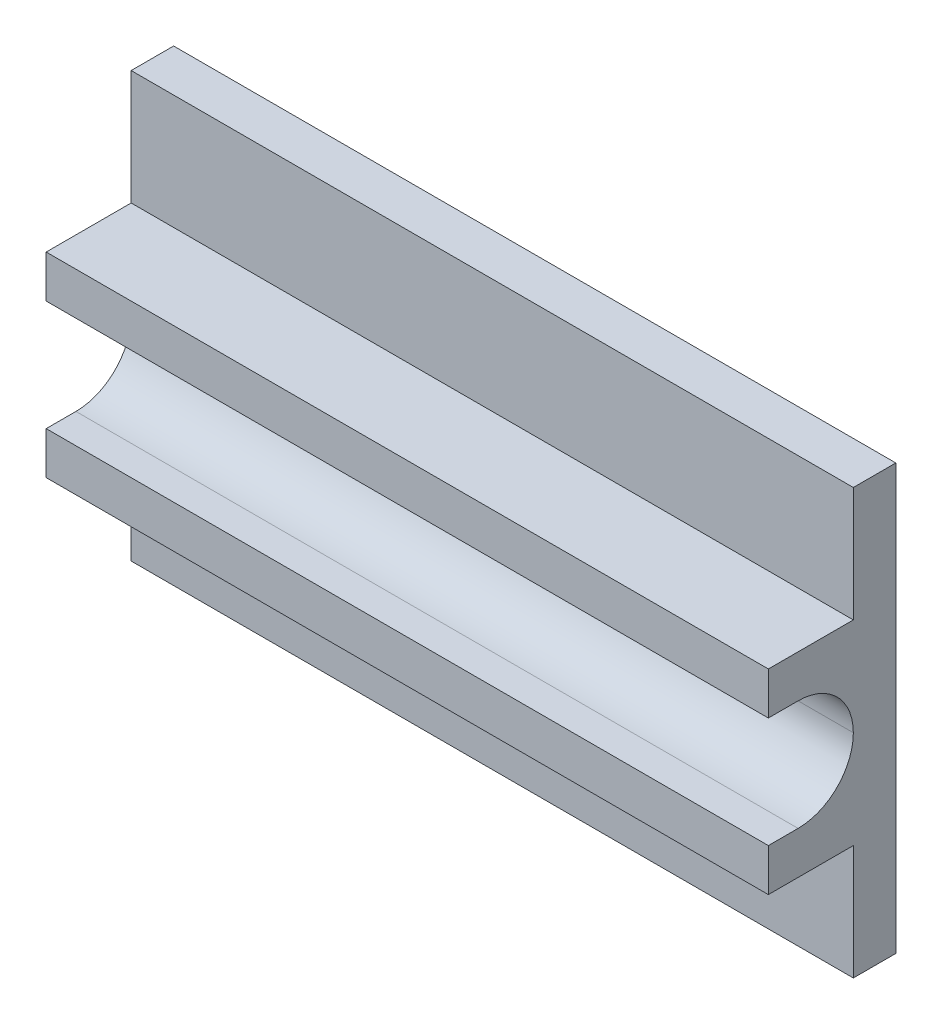
ISO-10303-21;
HEADER;
FILE_DESCRIPTION(('STEP AP214'),'2;1');
FILE_NAME('part.step','',(''),(''),'','','');
FILE_SCHEMA(('AUTOMOTIVE_DESIGN { 1 0 10303 214 1 1 1 1 }'));
ENDSEC;
DATA;
#1=APPLICATION_CONTEXT('core data for automotive mechanical design processes');
#2=APPLICATION_PROTOCOL_DEFINITION('international standard','automotive_design',2000,#1);
#3=PRODUCT_CONTEXT('',#1,'mechanical');
#4=PRODUCT('Part','Part','',(#3));
#5=PRODUCT_RELATED_PRODUCT_CATEGORY('part','',(#4));
#6=PRODUCT_DEFINITION_FORMATION('','',#4);
#7=PRODUCT_DEFINITION_CONTEXT('part definition',#1,'design');
#8=PRODUCT_DEFINITION('design','',#6,#7);
#9=PRODUCT_DEFINITION_SHAPE('','',#8);
#10=(LENGTH_UNIT() NAMED_UNIT(*) SI_UNIT(.MILLI.,.METRE.));
#11=(NAMED_UNIT(*) PLANE_ANGLE_UNIT() SI_UNIT($,.RADIAN.));
#12=(NAMED_UNIT(*) SI_UNIT($,.STERADIAN.) SOLID_ANGLE_UNIT());
#13=UNCERTAINTY_MEASURE_WITH_UNIT(LENGTH_MEASURE(1.E-05),#10,'distance_accuracy_value','');
#14=(GEOMETRIC_REPRESENTATION_CONTEXT(3) GLOBAL_UNCERTAINTY_ASSIGNED_CONTEXT((#13)) GLOBAL_UNIT_ASSIGNED_CONTEXT((#10,
#11,#12)) REPRESENTATION_CONTEXT('',''));
#15=CARTESIAN_POINT('',(0.,0.,0.));
#16=DIRECTION('',(0.,0.,1.));
#17=DIRECTION('',(1.,0.,0.));
#18=AXIS2_PLACEMENT_3D('',#15,#16,#17);
#19=CARTESIAN_POINT('',(0.,0.,1.));
#20=DIRECTION('',(0.,0.,1.));
#21=DIRECTION('',(1.,0.,0.));
#22=AXIS2_PLACEMENT_3D('',#19,#20,#21);
#23=PLANE('',#22);
#24=DIRECTION('',(0.,1.,0.));
#25=VECTOR('',#24,1.);
#26=CARTESIAN_POINT('',(7.,5.,1.));
#27=LINE('',#26,#25);
#28=CARTESIAN_POINT('',(7.,-5.,1.));
#29=VERTEX_POINT('',#28);
#30=CARTESIAN_POINT('',(7.,-2.3,1.));
#31=VERTEX_POINT('',#30);
#32=EDGE_CURVE('E186',#29,#31,#27,.T.);
#33=ORIENTED_EDGE('',*,*,#32,.T.);
#34=DIRECTION('',(1.,0.,0.));
#35=VECTOR('',#34,1.);
#36=CARTESIAN_POINT('',(-10.,-2.3,1.));
#37=LINE('',#36,#35);
#38=CARTESIAN_POINT('',(-10.,-2.3,1.));
#39=VERTEX_POINT('',#38);
#40=EDGE_CURVE('E145',#39,#31,#37,.T.);
#41=ORIENTED_EDGE('',*,*,#40,.F.);
#42=DIRECTION('',(0.,-1.,0.));
#43=VECTOR('',#42,1.);
#44=CARTESIAN_POINT('',(-10.,5.,1.));
#45=LINE('',#44,#43);
#46=CARTESIAN_POINT('',(-10.,-5.,1.));
#47=VERTEX_POINT('',#46);
#48=EDGE_CURVE('E151',#39,#47,#45,.T.);
#49=ORIENTED_EDGE('',*,*,#48,.T.);
#50=DIRECTION('',(1.,0.,0.));
#51=VECTOR('',#50,1.);
#52=CARTESIAN_POINT('',(-10.,-5.,1.));
#53=LINE('',#52,#51);
#54=EDGE_CURVE('E183',#47,#29,#53,.T.);
#55=ORIENTED_EDGE('',*,*,#54,.T.);
#56=EDGE_LOOP('',(#33,#41,#49,#55));
#57=FACE_BOUND('',#56,.T.);
#58=ADVANCED_FACE('F33',(#57),#23,.T.);
#59=DIRECTION('',(-1.,0.,0.));
#60=VECTOR('',#59,1.);
#61=CARTESIAN_POINT('',(-10.,2.3,1.));
#62=LINE('',#61,#60);
#63=CARTESIAN_POINT('',(7.,2.3,1.));
#64=VERTEX_POINT('',#63);
#65=CARTESIAN_POINT('',(-10.,2.3,1.));
#66=VERTEX_POINT('',#65);
#67=EDGE_CURVE('E152',#64,#66,#62,.T.);
#68=ORIENTED_EDGE('',*,*,#67,.F.);
#69=CARTESIAN_POINT('',(7.,5.,1.));
#70=VERTEX_POINT('',#69);
#71=EDGE_CURVE('E185',#64,#70,#27,.T.);
#72=ORIENTED_EDGE('',*,*,#71,.T.);
#73=DIRECTION('',(-1.,0.,0.));
#74=VECTOR('',#73,1.);
#75=CARTESIAN_POINT('',(-10.,5.,1.));
#76=LINE('',#75,#74);
#77=CARTESIAN_POINT('',(-10.,5.,1.));
#78=VERTEX_POINT('',#77);
#79=EDGE_CURVE('E189',#70,#78,#76,.T.);
#80=ORIENTED_EDGE('',*,*,#79,.T.);
#81=EDGE_CURVE('E181',#78,#66,#45,.T.);
#82=ORIENTED_EDGE('',*,*,#81,.T.);
#83=EDGE_LOOP('',(#68,#72,#80,#82));
#84=FACE_BOUND('',#83,.T.);
#85=ADVANCED_FACE('F254',(#84),#23,.T.);
#86=CARTESIAN_POINT('',(-10.,5.,1.));
#87=DIRECTION('',(1.,0.,0.));
#88=DIRECTION('',(0.,1.,0.));
#89=AXIS2_PLACEMENT_3D('',#86,#87,#88);
#90=PLANE('',#89);
#91=DIRECTION('',(0.,-1.,0.));
#92=VECTOR('',#91,1.);
#93=CARTESIAN_POINT('',(-10.,5.,0.));
#94=LINE('',#93,#92);
#95=CARTESIAN_POINT('',(-10.,5.,0.));
#96=VERTEX_POINT('',#95);
#97=CARTESIAN_POINT('',(-10.,-5.,0.));
#98=VERTEX_POINT('',#97);
#99=EDGE_CURVE('E180',#96,#98,#94,.T.);
#100=ORIENTED_EDGE('',*,*,#99,.T.);
#101=DIRECTION('',(0.,0.,-1.));
#102=VECTOR('',#101,1.);
#103=CARTESIAN_POINT('',(-10.,-5.,1.));
#104=LINE('',#103,#102);
#105=EDGE_CURVE('E207',#47,#98,#104,.T.);
#106=ORIENTED_EDGE('',*,*,#105,.F.);
#107=ORIENTED_EDGE('',*,*,#48,.F.);
#108=DIRECTION('',(0.,0.,-1.));
#109=VECTOR('',#108,1.);
#110=CARTESIAN_POINT('',(-10.,-2.3,3.));
#111=LINE('',#110,#109);
#112=CARTESIAN_POINT('',(-10.,-2.3,3.));
#113=VERTEX_POINT('',#112);
#114=EDGE_CURVE('E131',#113,#39,#111,.T.);
#115=ORIENTED_EDGE('',*,*,#114,.F.);
#116=DIRECTION('',(0.,-1.,0.));
#117=VECTOR('',#116,1.);
#118=CARTESIAN_POINT('',(-10.,-1.3,3.));
#119=LINE('',#118,#117);
#120=CARTESIAN_POINT('',(-10.,-1.3,3.));
#121=VERTEX_POINT('',#120);
#122=EDGE_CURVE('E138',#121,#113,#119,.T.);
#123=ORIENTED_EDGE('',*,*,#122,.F.);
#124=DIRECTION('',(0.,0.,-1.));
#125=VECTOR('',#124,1.);
#126=CARTESIAN_POINT('',(-10.,-1.3,3.));
#127=LINE('',#126,#125);
#128=CARTESIAN_POINT('',(-10.,-1.3,2.3));
#129=VERTEX_POINT('',#128);
#130=EDGE_CURVE('E227',#121,#129,#127,.T.);
#131=ORIENTED_EDGE('',*,*,#130,.T.);
#132=CARTESIAN_POINT('',(-10.,0.,2.3));
#133=DIRECTION('',(1.,0.,0.));
#134=DIRECTION('',(0.,1.,0.));
#135=AXIS2_PLACEMENT_3D('',#132,#133,#134);
#136=CIRCLE('',#135,1.3);
#137=CARTESIAN_POINT('',(-10.,0.,1.));
#138=VERTEX_POINT('',#137);
#139=EDGE_CURVE('E55',#129,#138,#136,.T.);
#140=ORIENTED_EDGE('',*,*,#139,.T.);
#141=CARTESIAN_POINT('',(-10.,0.,2.3));
#142=DIRECTION('',(1.,0.,0.));
#143=DIRECTION('',(0.,1.,0.));
#144=AXIS2_PLACEMENT_3D('',#141,#142,#143);
#145=CIRCLE('',#144,1.3);
#146=CARTESIAN_POINT('',(-10.,1.3,2.3));
#147=VERTEX_POINT('',#146);
#148=EDGE_CURVE('E11',#138,#147,#145,.T.);
#149=ORIENTED_EDGE('',*,*,#148,.T.);
#150=DIRECTION('',(0.,0.,-1.));
#151=VECTOR('',#150,1.);
#152=CARTESIAN_POINT('',(-10.,1.3,3.));
#153=LINE('',#152,#151);
#154=CARTESIAN_POINT('',(-10.,1.3,3.));
#155=VERTEX_POINT('',#154);
#156=EDGE_CURVE('E177',#155,#147,#153,.T.);
#157=ORIENTED_EDGE('',*,*,#156,.F.);
#158=DIRECTION('',(0.,-1.,0.));
#159=VECTOR('',#158,1.);
#160=CARTESIAN_POINT('',(-10.,2.3,3.));
#161=LINE('',#160,#159);
#162=CARTESIAN_POINT('',(-10.,2.3,3.));
#163=VERTEX_POINT('',#162);
#164=EDGE_CURVE('E155',#163,#155,#161,.T.);
#165=ORIENTED_EDGE('',*,*,#164,.F.);
#166=DIRECTION('',(0.,0.,-1.));
#167=VECTOR('',#166,1.);
#168=CARTESIAN_POINT('',(-10.,2.3,3.));
#169=LINE('',#168,#167);
#170=EDGE_CURVE('E168',#163,#66,#169,.T.);
#171=ORIENTED_EDGE('',*,*,#170,.T.);
#172=ORIENTED_EDGE('',*,*,#81,.F.);
#173=DIRECTION('',(0.,0.,-1.));
#174=VECTOR('',#173,1.);
#175=CARTESIAN_POINT('',(-10.,5.,1.));
#176=LINE('',#175,#174);
#177=EDGE_CURVE('E191',#78,#96,#176,.T.);
#178=ORIENTED_EDGE('',*,*,#177,.T.);
#179=EDGE_LOOP('',(#100,#106,#107,#115,#123,#131,#140,#149,#157,#165,#171,#172,#178));
#180=FACE_BOUND('',#179,.T.);
#181=ADVANCED_FACE('F149',(#180),#90,.F.);
#182=CARTESIAN_POINT('',(-10.,-5.,1.));
#183=DIRECTION('',(0.,1.,0.));
#184=DIRECTION('',(0.,0.,1.));
#185=AXIS2_PLACEMENT_3D('',#182,#183,#184);
#186=PLANE('',#185);
#187=DIRECTION('',(1.,0.,0.));
#188=VECTOR('',#187,1.);
#189=CARTESIAN_POINT('',(-10.,-5.,0.));
#190=LINE('',#189,#188);
#191=CARTESIAN_POINT('',(7.,-5.,0.));
#192=VERTEX_POINT('',#191);
#193=EDGE_CURVE('E193',#98,#192,#190,.T.);
#194=ORIENTED_EDGE('',*,*,#193,.T.);
#195=DIRECTION('',(0.,0.,-1.));
#196=VECTOR('',#195,1.);
#197=CARTESIAN_POINT('',(7.,-5.,1.));
#198=LINE('',#197,#196);
#199=EDGE_CURVE('E204',#29,#192,#198,.T.);
#200=ORIENTED_EDGE('',*,*,#199,.F.);
#201=ORIENTED_EDGE('',*,*,#54,.F.);
#202=ORIENTED_EDGE('',*,*,#105,.T.);
#203=EDGE_LOOP('',(#194,#200,#201,#202));
#204=FACE_BOUND('',#203,.T.);
#205=ADVANCED_FACE('F239',(#204),#186,.F.);
#206=CARTESIAN_POINT('',(7.,5.,1.));
#207=DIRECTION('',(-1.,0.,0.));
#208=DIRECTION('',(0.,-1.,0.));
#209=AXIS2_PLACEMENT_3D('',#206,#207,#208);
#210=PLANE('',#209);
#211=DIRECTION('',(0.,1.,0.));
#212=VECTOR('',#211,1.);
#213=CARTESIAN_POINT('',(7.,5.,0.));
#214=LINE('',#213,#212);
#215=CARTESIAN_POINT('',(7.,5.,0.));
#216=VERTEX_POINT('',#215);
#217=EDGE_CURVE('E195',#192,#216,#214,.T.);
#218=ORIENTED_EDGE('',*,*,#217,.T.);
#219=DIRECTION('',(0.,0.,-1.));
#220=VECTOR('',#219,1.);
#221=CARTESIAN_POINT('',(7.,5.,1.));
#222=LINE('',#221,#220);
#223=EDGE_CURVE('E201',#70,#216,#222,.T.);
#224=ORIENTED_EDGE('',*,*,#223,.F.);
#225=ORIENTED_EDGE('',*,*,#71,.F.);
#226=DIRECTION('',(0.,0.,-1.));
#227=VECTOR('',#226,1.);
#228=CARTESIAN_POINT('',(7.,2.3,3.));
#229=LINE('',#228,#227);
#230=CARTESIAN_POINT('',(7.,2.3,3.));
#231=VERTEX_POINT('',#230);
#232=EDGE_CURVE('E172',#231,#64,#229,.T.);
#233=ORIENTED_EDGE('',*,*,#232,.F.);
#234=DIRECTION('',(0.,1.,0.));
#235=VECTOR('',#234,1.);
#236=CARTESIAN_POINT('',(7.,2.3,3.));
#237=LINE('',#236,#235);
#238=CARTESIAN_POINT('',(7.,1.3,3.));
#239=VERTEX_POINT('',#238);
#240=EDGE_CURVE('E165',#239,#231,#237,.T.);
#241=ORIENTED_EDGE('',*,*,#240,.F.);
#242=DIRECTION('',(0.,0.,-1.));
#243=VECTOR('',#242,1.);
#244=CARTESIAN_POINT('',(7.,1.3,3.));
#245=LINE('',#244,#243);
#246=CARTESIAN_POINT('',(7.,1.3,2.3));
#247=VERTEX_POINT('',#246);
#248=EDGE_CURVE('E175',#239,#247,#245,.T.);
#249=ORIENTED_EDGE('',*,*,#248,.T.);
#250=CARTESIAN_POINT('',(7.,0.,2.3));
#251=DIRECTION('',(-1.,0.,0.));
#252=DIRECTION('',(0.,-1.,0.));
#253=AXIS2_PLACEMENT_3D('',#250,#251,#252);
#254=CIRCLE('',#253,1.3);
#255=CARTESIAN_POINT('',(7.,0.,1.));
#256=VERTEX_POINT('',#255);
#257=EDGE_CURVE('E42',#247,#256,#254,.T.);
#258=ORIENTED_EDGE('',*,*,#257,.T.);
#259=CARTESIAN_POINT('',(7.,0.,2.3));
#260=DIRECTION('',(-1.,0.,0.));
#261=DIRECTION('',(0.,-1.,0.));
#262=AXIS2_PLACEMENT_3D('',#259,#260,#261);
#263=CIRCLE('',#262,1.3);
#264=CARTESIAN_POINT('',(7.,-1.3,2.3));
#265=VERTEX_POINT('',#264);
#266=EDGE_CURVE('E216',#256,#265,#263,.T.);
#267=ORIENTED_EDGE('',*,*,#266,.T.);
#268=DIRECTION('',(0.,0.,-1.));
#269=VECTOR('',#268,1.);
#270=CARTESIAN_POINT('',(7.,-1.3,3.));
#271=LINE('',#270,#269);
#272=CARTESIAN_POINT('',(7.,-1.3,3.));
#273=VERTEX_POINT('',#272);
#274=EDGE_CURVE('E157',#273,#265,#271,.T.);
#275=ORIENTED_EDGE('',*,*,#274,.F.);
#276=DIRECTION('',(0.,1.,0.));
#277=VECTOR('',#276,1.);
#278=CARTESIAN_POINT('',(7.,-1.3,3.));
#279=LINE('',#278,#277);
#280=CARTESIAN_POINT('',(7.,-2.3,3.));
#281=VERTEX_POINT('',#280);
#282=EDGE_CURVE('E137',#281,#273,#279,.T.);
#283=ORIENTED_EDGE('',*,*,#282,.F.);
#284=DIRECTION('',(0.,0.,-1.));
#285=VECTOR('',#284,1.);
#286=CARTESIAN_POINT('',(7.,-2.3,3.));
#287=LINE('',#286,#285);
#288=EDGE_CURVE('E134',#281,#31,#287,.T.);
#289=ORIENTED_EDGE('',*,*,#288,.T.);
#290=ORIENTED_EDGE('',*,*,#32,.F.);
#291=ORIENTED_EDGE('',*,*,#199,.T.);
#292=EDGE_LOOP('',(#218,#224,#225,#233,#241,#249,#258,#267,#275,#283,#289,#290,#291));
#293=FACE_BOUND('',#292,.T.);
#294=ADVANCED_FACE('F221',(#293),#210,.F.);
#295=CARTESIAN_POINT('',(-10.,5.,1.));
#296=DIRECTION('',(0.,-1.,0.));
#297=DIRECTION('',(0.,0.,-1.));
#298=AXIS2_PLACEMENT_3D('',#295,#296,#297);
#299=PLANE('',#298);
#300=DIRECTION('',(-1.,0.,0.));
#301=VECTOR('',#300,1.);
#302=CARTESIAN_POINT('',(-10.,5.,0.));
#303=LINE('',#302,#301);
#304=EDGE_CURVE('E197',#216,#96,#303,.T.);
#305=ORIENTED_EDGE('',*,*,#304,.T.);
#306=ORIENTED_EDGE('',*,*,#177,.F.);
#307=ORIENTED_EDGE('',*,*,#79,.F.);
#308=ORIENTED_EDGE('',*,*,#223,.T.);
#309=EDGE_LOOP('',(#305,#306,#307,#308));
#310=FACE_BOUND('',#309,.T.);
#311=ADVANCED_FACE('F248',(#310),#299,.F.);
#312=CARTESIAN_POINT('',(0.,0.,0.));
#313=DIRECTION('',(0.,0.,1.));
#314=DIRECTION('',(1.,0.,0.));
#315=AXIS2_PLACEMENT_3D('',#312,#313,#314);
#316=PLANE('',#315);
#317=ORIENTED_EDGE('',*,*,#99,.F.);
#318=ORIENTED_EDGE('',*,*,#304,.F.);
#319=ORIENTED_EDGE('',*,*,#217,.F.);
#320=ORIENTED_EDGE('',*,*,#193,.F.);
#321=EDGE_LOOP('',(#317,#318,#319,#320));
#322=FACE_BOUND('',#321,.T.);
#323=ADVANCED_FACE('F245',(#322),#316,.F.);
#324=CARTESIAN_POINT('',(-10.,1.3,3.));
#325=DIRECTION('',(0.,1.,0.));
#326=DIRECTION('',(0.,0.,1.));
#327=AXIS2_PLACEMENT_3D('',#324,#325,#326);
#328=PLANE('',#327);
#329=ORIENTED_EDGE('',*,*,#156,.T.);
#330=DIRECTION('',(1.,0.,0.));
#331=VECTOR('',#330,1.);
#332=CARTESIAN_POINT('',(-10.,1.3,2.3));
#333=LINE('',#332,#331);
#334=EDGE_CURVE('E213',#147,#247,#333,.T.);
#335=ORIENTED_EDGE('',*,*,#334,.T.);
#336=ORIENTED_EDGE('',*,*,#248,.F.);
#337=DIRECTION('',(1.,0.,0.));
#338=VECTOR('',#337,1.);
#339=CARTESIAN_POINT('',(-10.,1.3,3.));
#340=LINE('',#339,#338);
#341=EDGE_CURVE('E163',#155,#239,#340,.T.);
#342=ORIENTED_EDGE('',*,*,#341,.F.);
#343=EDGE_LOOP('',(#329,#335,#336,#342));
#344=FACE_BOUND('',#343,.T.);
#345=ADVANCED_FACE('F266',(#344),#328,.F.);
#346=CARTESIAN_POINT('',(-10.,2.3,3.));
#347=DIRECTION('',(0.,-1.,0.));
#348=DIRECTION('',(0.,0.,-1.));
#349=AXIS2_PLACEMENT_3D('',#346,#347,#348);
#350=PLANE('',#349);
#351=ORIENTED_EDGE('',*,*,#67,.T.);
#352=ORIENTED_EDGE('',*,*,#170,.F.);
#353=DIRECTION('',(-1.,0.,0.));
#354=VECTOR('',#353,1.);
#355=CARTESIAN_POINT('',(-10.,2.3,3.));
#356=LINE('',#355,#354);
#357=EDGE_CURVE('E167',#231,#163,#356,.T.);
#358=ORIENTED_EDGE('',*,*,#357,.F.);
#359=ORIENTED_EDGE('',*,*,#232,.T.);
#360=EDGE_LOOP('',(#351,#352,#358,#359));
#361=FACE_BOUND('',#360,.T.);
#362=ADVANCED_FACE('F257',(#361),#350,.F.);
#363=CARTESIAN_POINT('',(0.,0.,3.));
#364=DIRECTION('',(0.,0.,1.));
#365=DIRECTION('',(1.,0.,0.));
#366=AXIS2_PLACEMENT_3D('',#363,#364,#365);
#367=PLANE('',#366);
#368=ORIENTED_EDGE('',*,*,#164,.T.);
#369=ORIENTED_EDGE('',*,*,#341,.T.);
#370=ORIENTED_EDGE('',*,*,#240,.T.);
#371=ORIENTED_EDGE('',*,*,#357,.T.);
#372=EDGE_LOOP('',(#368,#369,#370,#371));
#373=FACE_BOUND('',#372,.T.);
#374=ADVANCED_FACE('F263',(#373),#367,.T.);
#375=CARTESIAN_POINT('',(-10.,-2.3,3.));
#376=DIRECTION('',(0.,1.,0.));
#377=DIRECTION('',(0.,0.,1.));
#378=AXIS2_PLACEMENT_3D('',#375,#376,#377);
#379=PLANE('',#378);
#380=ORIENTED_EDGE('',*,*,#40,.T.);
#381=ORIENTED_EDGE('',*,*,#288,.F.);
#382=DIRECTION('',(1.,0.,0.));
#383=VECTOR('',#382,1.);
#384=CARTESIAN_POINT('',(-10.,-2.3,3.));
#385=LINE('',#384,#383);
#386=EDGE_CURVE('E127',#113,#281,#385,.T.);
#387=ORIENTED_EDGE('',*,*,#386,.F.);
#388=ORIENTED_EDGE('',*,*,#114,.T.);
#389=EDGE_LOOP('',(#380,#381,#387,#388));
#390=FACE_BOUND('',#389,.T.);
#391=ADVANCED_FACE('F129',(#390),#379,.F.);
#392=CARTESIAN_POINT('',(-10.,-1.3,3.));
#393=DIRECTION('',(0.,-1.,0.));
#394=DIRECTION('',(0.,0.,-1.));
#395=AXIS2_PLACEMENT_3D('',#392,#393,#394);
#396=PLANE('',#395);
#397=ORIENTED_EDGE('',*,*,#274,.T.);
#398=DIRECTION('',(-1.,0.,0.));
#399=VECTOR('',#398,1.);
#400=CARTESIAN_POINT('',(-10.,-1.3,2.3));
#401=LINE('',#400,#399);
#402=EDGE_CURVE('E210',#265,#129,#401,.T.);
#403=ORIENTED_EDGE('',*,*,#402,.T.);
#404=ORIENTED_EDGE('',*,*,#130,.F.);
#405=DIRECTION('',(-1.,0.,0.));
#406=VECTOR('',#405,1.);
#407=CARTESIAN_POINT('',(-10.,-1.3,3.));
#408=LINE('',#407,#406);
#409=EDGE_CURVE('E143',#273,#121,#408,.T.);
#410=ORIENTED_EDGE('',*,*,#409,.F.);
#411=EDGE_LOOP('',(#397,#403,#404,#410));
#412=FACE_BOUND('',#411,.T.);
#413=ADVANCED_FACE('F226',(#412),#396,.F.);
#414=CARTESIAN_POINT('',(0.,0.,3.));
#415=DIRECTION('',(0.,0.,1.));
#416=DIRECTION('',(1.,0.,0.));
#417=AXIS2_PLACEMENT_3D('',#414,#415,#416);
#418=PLANE('',#417);
#419=ORIENTED_EDGE('',*,*,#122,.T.);
#420=ORIENTED_EDGE('',*,*,#386,.T.);
#421=ORIENTED_EDGE('',*,*,#282,.T.);
#422=ORIENTED_EDGE('',*,*,#409,.T.);
#423=EDGE_LOOP('',(#419,#420,#421,#422));
#424=FACE_BOUND('',#423,.T.);
#425=ADVANCED_FACE('F141',(#424),#418,.T.);
#426=CARTESIAN_POINT('',(-10.,0.,2.3));
#427=DIRECTION('',(1.,0.,0.));
#428=DIRECTION('',(0.,0.,-1.));
#429=AXIS2_PLACEMENT_3D('',#426,#427,#428);
#430=CYLINDRICAL_SURFACE('',#429,1.3);
#431=DIRECTION('',(1.,0.,0.));
#432=VECTOR('',#431,1.);
#433=CARTESIAN_POINT('',(0.,0.,1.));
#434=LINE('',#433,#432);
#435=EDGE_CURVE('E37',#256,#138,#434,.F.);
#436=ORIENTED_EDGE('',*,*,#435,.F.);
#437=ORIENTED_EDGE('',*,*,#257,.F.);
#438=ORIENTED_EDGE('',*,*,#334,.F.);
#439=ORIENTED_EDGE('',*,*,#148,.F.);
#440=EDGE_LOOP('',(#436,#437,#438,#439));
#441=FACE_BOUND('',#440,.T.);
#442=ADVANCED_FACE('F35',(#441),#430,.F.);
#443=CARTESIAN_POINT('',(-10.,0.,2.3));
#444=DIRECTION('',(-1.,0.,0.));
#445=DIRECTION('',(0.,0.,1.));
#446=AXIS2_PLACEMENT_3D('',#443,#444,#445);
#447=CYLINDRICAL_SURFACE('',#446,1.3);
#448=ORIENTED_EDGE('',*,*,#266,.F.);
#449=ORIENTED_EDGE('',*,*,#435,.T.);
#450=ORIENTED_EDGE('',*,*,#139,.F.);
#451=ORIENTED_EDGE('',*,*,#402,.F.);
#452=EDGE_LOOP('',(#448,#449,#450,#451));
#453=FACE_BOUND('',#452,.T.);
#454=ADVANCED_FACE('F228',(#453),#447,.F.);
#455=CLOSED_SHELL('',(#58,#85,#181,#205,#294,#311,#323,#345,#362,#374,#391,#413,#425,#442,#454));
#456=MANIFOLD_SOLID_BREP('B2',#455);
#457=ADVANCED_BREP_SHAPE_REPRESENTATION('',(#18,#456),#14);
#458=SHAPE_DEFINITION_REPRESENTATION(#9,#457);
ENDSEC;
END-ISO-10303-21;
